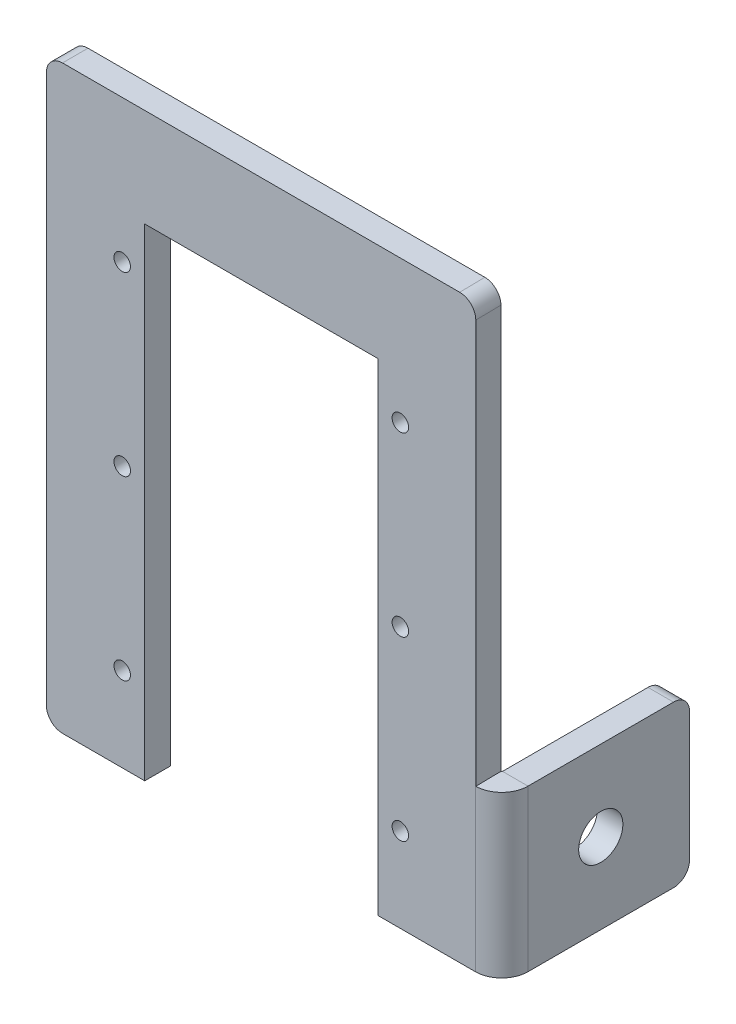
ISO-10303-21;
HEADER;
FILE_DESCRIPTION(('STEP AP214'),'2;1');
FILE_NAME('part.step','',(''),(''),'','','');
FILE_SCHEMA(('AUTOMOTIVE_DESIGN { 1 0 10303 214 1 1 1 1 }'));
ENDSEC;
DATA;
#1=APPLICATION_CONTEXT('core data for automotive mechanical design processes');
#2=APPLICATION_PROTOCOL_DEFINITION('international standard','automotive_design',2000,#1);
#3=PRODUCT_CONTEXT('',#1,'mechanical');
#4=PRODUCT('Part','Part','',(#3));
#5=PRODUCT_RELATED_PRODUCT_CATEGORY('part','',(#4));
#6=PRODUCT_DEFINITION_FORMATION('','',#4);
#7=PRODUCT_DEFINITION_CONTEXT('part definition',#1,'design');
#8=PRODUCT_DEFINITION('design','',#6,#7);
#9=PRODUCT_DEFINITION_SHAPE('','',#8);
#10=(LENGTH_UNIT() NAMED_UNIT(*) SI_UNIT(.MILLI.,.METRE.));
#11=(NAMED_UNIT(*) PLANE_ANGLE_UNIT() SI_UNIT($,.RADIAN.));
#12=(NAMED_UNIT(*) SI_UNIT($,.STERADIAN.) SOLID_ANGLE_UNIT());
#13=UNCERTAINTY_MEASURE_WITH_UNIT(LENGTH_MEASURE(1.E-05),#10,'distance_accuracy_value','');
#14=(GEOMETRIC_REPRESENTATION_CONTEXT(3) GLOBAL_UNCERTAINTY_ASSIGNED_CONTEXT((#13)) GLOBAL_UNIT_ASSIGNED_CONTEXT((#10,
#11,#12)) REPRESENTATION_CONTEXT('',''));
#15=CARTESIAN_POINT('',(0.,0.,0.));
#16=DIRECTION('',(0.,0.,1.));
#17=DIRECTION('',(1.,0.,0.));
#18=AXIS2_PLACEMENT_3D('',#15,#16,#17);
#19=CARTESIAN_POINT('',(26.7316212801133,-30.,6.625));
#20=DIRECTION('',(0.,1.,0.));
#21=DIRECTION('',(1.,0.,0.));
#22=AXIS2_PLACEMENT_3D('',#19,#20,#21);
#23=PLANE('',#22);
#24=DIRECTION('',(0.,0.,1.));
#25=VECTOR('',#24,1.);
#26=CARTESIAN_POINT('',(29.9066212801133,-30.,6.62499999999999));
#27=LINE('',#26,#25);
#28=CARTESIAN_POINT('',(29.9066212801132,-30.,-21.375));
#29=VERTEX_POINT('',#28);
#30=CARTESIAN_POINT('',(29.9066212801132,-30.,-3.27500000000002));
#31=VERTEX_POINT('',#30);
#32=EDGE_CURVE('E211',#29,#31,#27,.T.);
#33=ORIENTED_EDGE('',*,*,#32,.F.);
#34=DIRECTION('',(1.,0.,0.));
#35=VECTOR('',#34,1.);
#36=CARTESIAN_POINT('',(26.7316212801132,-30.,-21.375));
#37=LINE('',#36,#35);
#38=CARTESIAN_POINT('',(26.7316212801132,-30.,-21.375));
#39=VERTEX_POINT('',#38);
#40=EDGE_CURVE('E265',#29,#39,#37,.F.);
#41=ORIENTED_EDGE('',*,*,#40,.T.);
#42=DIRECTION('',(0.,0.,1.));
#43=VECTOR('',#42,1.);
#44=CARTESIAN_POINT('',(26.7316212801133,-30.,6.625));
#45=LINE('',#44,#43);
#46=CARTESIAN_POINT('',(26.7316212801132,-30.,-3.27499999999999));
#47=VERTEX_POINT('',#46);
#48=EDGE_CURVE('E188',#39,#47,#45,.T.);
#49=ORIENTED_EDGE('',*,*,#48,.T.);
#50=DIRECTION('',(1.,0.,0.));
#51=VECTOR('',#50,1.);
#52=CARTESIAN_POINT('',(26.7316212801132,-30.,-3.27499999999999));
#53=LINE('',#52,#51);
#54=EDGE_CURVE('E221',#47,#31,#53,.T.);
#55=ORIENTED_EDGE('',*,*,#54,.T.);
#56=EDGE_LOOP('',(#33,#41,#49,#55));
#57=FACE_BOUND('',#56,.T.);
#58=ADVANCED_FACE('F42',(#57),#23,.T.);
#59=CARTESIAN_POINT('',(26.7316212801132,-50.,-23.375));
#60=DIRECTION('',(0.,-1.,0.));
#61=DIRECTION('',(0.,0.,-1.));
#62=AXIS2_PLACEMENT_3D('',#59,#60,#61);
#63=PLANE('',#62);
#64=DIRECTION('',(0.,0.,-1.));
#65=VECTOR('',#64,1.);
#66=CARTESIAN_POINT('',(26.7316212801132,-50.,-23.375));
#67=LINE('',#66,#65);
#68=CARTESIAN_POINT('',(26.7316212801132,-50.,-3.275));
#69=VERTEX_POINT('',#68);
#70=CARTESIAN_POINT('',(26.7316212801132,-50.,-21.375));
#71=VERTEX_POINT('',#70);
#72=EDGE_CURVE('E202',#69,#71,#67,.T.);
#73=ORIENTED_EDGE('',*,*,#72,.T.);
#74=DIRECTION('',(1.,0.,0.));
#75=VECTOR('',#74,1.);
#76=CARTESIAN_POINT('',(26.7316212801132,-50.,-21.375));
#77=LINE('',#76,#75);
#78=CARTESIAN_POINT('',(29.9066212801132,-50.,-21.375));
#79=VERTEX_POINT('',#78);
#80=EDGE_CURVE('E251',#71,#79,#77,.T.);
#81=ORIENTED_EDGE('',*,*,#80,.T.);
#82=DIRECTION('',(0.,0.,-1.));
#83=VECTOR('',#82,1.);
#84=CARTESIAN_POINT('',(29.9066212801132,-50.,-23.375));
#85=LINE('',#84,#83);
#86=CARTESIAN_POINT('',(29.9066212801132,-50.,-3.27500000000003));
#87=VERTEX_POINT('',#86);
#88=EDGE_CURVE('E216',#87,#79,#85,.T.);
#89=ORIENTED_EDGE('',*,*,#88,.F.);
#90=DIRECTION('',(-1.,0.,0.));
#91=VECTOR('',#90,1.);
#92=CARTESIAN_POINT('',(26.7316212801132,-50.,-3.275));
#93=LINE('',#92,#91);
#94=EDGE_CURVE('E187',#87,#69,#93,.T.);
#95=ORIENTED_EDGE('',*,*,#94,.T.);
#96=EDGE_LOOP('',(#73,#81,#89,#95));
#97=FACE_BOUND('',#96,.T.);
#98=ADVANCED_FACE('F214',(#97),#63,.T.);
#99=CARTESIAN_POINT('',(26.7316212801134,0.,33.3566212801132));
#100=DIRECTION('',(-1.,0.,0.));
#101=DIRECTION('',(0.,0.,1.));
#102=AXIS2_PLACEMENT_3D('',#99,#100,#101);
#103=PLANE('',#102);
#104=CARTESIAN_POINT('',(26.7316212801132,-40.,-12.325));
#105=DIRECTION('',(-1.,0.,0.));
#106=DIRECTION('',(0.,0.,1.));
#107=AXIS2_PLACEMENT_3D('',#104,#105,#106);
#108=CIRCLE('',#107,2.75);
#109=CARTESIAN_POINT('',(26.7316212801132,-40.,-9.57499999999999));
#110=VERTEX_POINT('',#109);
#111=EDGE_CURVE('E512',#110,#110,#108,.T.);
#112=ORIENTED_EDGE('',*,*,#111,.F.);
#113=EDGE_LOOP('',(#112));
#114=FACE_BOUND('',#113,.T.);
#115=DIRECTION('',(0.,1.,0.));
#116=VECTOR('',#115,1.);
#117=CARTESIAN_POINT('',(26.7316212801132,-30.,-23.375));
#118=LINE('',#117,#116);
#119=CARTESIAN_POINT('',(26.7316212801132,-48.,-23.375));
#120=VERTEX_POINT('',#119);
#121=CARTESIAN_POINT('',(26.7316212801132,-32.,-23.375));
#122=VERTEX_POINT('',#121);
#123=EDGE_CURVE('E210',#120,#122,#118,.T.);
#124=ORIENTED_EDGE('',*,*,#123,.F.);
#125=CARTESIAN_POINT('',(26.7316212801132,-48.,-21.375));
#126=DIRECTION('',(-1.,0.,0.));
#127=DIRECTION('',(0.,0.,1.));
#128=AXIS2_PLACEMENT_3D('',#125,#126,#127);
#129=CIRCLE('',#128,2.);
#130=EDGE_CURVE('E206',#120,#71,#129,.T.);
#131=ORIENTED_EDGE('',*,*,#130,.T.);
#132=ORIENTED_EDGE('',*,*,#72,.F.);
#133=DIRECTION('',(0.,1.,0.));
#134=VECTOR('',#133,1.);
#135=CARTESIAN_POINT('',(26.7316212801132,0.,-3.27499999999999));
#136=LINE('',#135,#134);
#137=EDGE_CURVE('E177',#69,#47,#136,.T.);
#138=ORIENTED_EDGE('',*,*,#137,.T.);
#139=ORIENTED_EDGE('',*,*,#48,.F.);
#140=CARTESIAN_POINT('',(26.7316212801132,-32.,-21.375));
#141=DIRECTION('',(-1.,0.,0.));
#142=DIRECTION('',(0.,0.,1.));
#143=AXIS2_PLACEMENT_3D('',#140,#141,#142);
#144=CIRCLE('',#143,2.);
#145=EDGE_CURVE('E262',#39,#122,#144,.T.);
#146=ORIENTED_EDGE('',*,*,#145,.T.);
#147=EDGE_LOOP('',(#124,#131,#132,#138,#139,#146));
#148=FACE_BOUND('',#147,.T.);
#149=ADVANCED_FACE('F204',(#114,#148),#103,.T.);
#150=CARTESIAN_POINT('',(26.7316212801132,-30.,-23.375));
#151=DIRECTION('',(0.,0.,-1.));
#152=DIRECTION('',(-1.,0.,0.));
#153=AXIS2_PLACEMENT_3D('',#150,#151,#152);
#154=PLANE('',#153);
#155=DIRECTION('',(0.,1.,0.));
#156=VECTOR('',#155,1.);
#157=CARTESIAN_POINT('',(29.9066212801132,-30.,-23.375));
#158=LINE('',#157,#156);
#159=CARTESIAN_POINT('',(29.9066212801132,-48.,-23.375));
#160=VERTEX_POINT('',#159);
#161=CARTESIAN_POINT('',(29.9066212801132,-32.,-23.375));
#162=VERTEX_POINT('',#161);
#163=EDGE_CURVE('E230',#160,#162,#158,.T.);
#164=ORIENTED_EDGE('',*,*,#163,.F.);
#165=DIRECTION('',(1.,0.,0.));
#166=VECTOR('',#165,1.);
#167=CARTESIAN_POINT('',(26.7316212801132,-48.,-23.375));
#168=LINE('',#167,#166);
#169=EDGE_CURVE('E260',#160,#120,#168,.F.);
#170=ORIENTED_EDGE('',*,*,#169,.T.);
#171=ORIENTED_EDGE('',*,*,#123,.T.);
#172=DIRECTION('',(1.,0.,0.));
#173=VECTOR('',#172,1.);
#174=CARTESIAN_POINT('',(26.7316212801132,-32.,-23.375));
#175=LINE('',#174,#173);
#176=EDGE_CURVE('E257',#122,#162,#175,.T.);
#177=ORIENTED_EDGE('',*,*,#176,.T.);
#178=EDGE_LOOP('',(#164,#170,#171,#177));
#179=FACE_BOUND('',#178,.T.);
#180=ADVANCED_FACE('F357',(#179),#154,.T.);
#181=CARTESIAN_POINT('',(29.9066212801134,0.,33.3566212801132));
#182=DIRECTION('',(-1.,0.,0.));
#183=DIRECTION('',(0.,0.,1.));
#184=AXIS2_PLACEMENT_3D('',#181,#182,#183);
#185=PLANE('',#184);
#186=CARTESIAN_POINT('',(29.9066212801133,-40.,-12.325));
#187=DIRECTION('',(-1.,0.,0.));
#188=DIRECTION('',(0.,0.,1.));
#189=AXIS2_PLACEMENT_3D('',#186,#187,#188);
#190=CIRCLE('',#189,2.75);
#191=CARTESIAN_POINT('',(29.9066212801133,-40.,-9.575));
#192=VERTEX_POINT('',#191);
#193=EDGE_CURVE('E508',#192,#192,#190,.T.);
#194=ORIENTED_EDGE('',*,*,#193,.T.);
#195=EDGE_LOOP('',(#194));
#196=FACE_BOUND('',#195,.T.);
#197=ORIENTED_EDGE('',*,*,#88,.T.);
#198=CARTESIAN_POINT('',(29.9066212801132,-48.,-21.375));
#199=DIRECTION('',(-1.,0.,0.));
#200=DIRECTION('',(0.,0.,1.));
#201=AXIS2_PLACEMENT_3D('',#198,#199,#200);
#202=CIRCLE('',#201,2.);
#203=EDGE_CURVE('E255',#79,#160,#202,.F.);
#204=ORIENTED_EDGE('',*,*,#203,.T.);
#205=ORIENTED_EDGE('',*,*,#163,.T.);
#206=CARTESIAN_POINT('',(29.9066212801132,-32.,-21.375));
#207=DIRECTION('',(-1.,0.,0.));
#208=DIRECTION('',(0.,0.,1.));
#209=AXIS2_PLACEMENT_3D('',#206,#207,#208);
#210=CIRCLE('',#209,2.);
#211=EDGE_CURVE('E253',#162,#29,#210,.F.);
#212=ORIENTED_EDGE('',*,*,#211,.T.);
#213=ORIENTED_EDGE('',*,*,#32,.T.);
#214=DIRECTION('',(0.,1.,0.));
#215=VECTOR('',#214,1.);
#216=CARTESIAN_POINT('',(29.9066212801132,0.,-3.275));
#217=LINE('',#216,#215);
#218=EDGE_CURVE('E218',#87,#31,#217,.T.);
#219=ORIENTED_EDGE('',*,*,#218,.F.);
#220=EDGE_LOOP('',(#197,#204,#205,#212,#213,#219));
#221=FACE_BOUND('',#220,.T.);
#222=ADVANCED_FACE('F301',(#196,#221),#185,.F.);
#223=CARTESIAN_POINT('',(17.3,-39.5,-3.175));
#224=DIRECTION('',(0.,0.,1.));
#225=DIRECTION('',(1.,0.,0.));
#226=AXIS2_PLACEMENT_3D('',#223,#224,#225);
#227=CYLINDRICAL_SURFACE('',#226,1.02499999999995);
#228=CARTESIAN_POINT('',(17.3,-39.5,-3.175));
#229=DIRECTION('',(0.,0.,1.));
#230=DIRECTION('',(1.,0.,0.));
#231=AXIS2_PLACEMENT_3D('',#228,#229,#230);
#232=CIRCLE('',#231,1.02499999999995);
#233=CARTESIAN_POINT('',(18.325,-39.5,-3.175));
#234=VERTEX_POINT('',#233);
#235=EDGE_CURVE('E430',#234,#234,#232,.T.);
#236=ORIENTED_EDGE('',*,*,#235,.F.);
#237=EDGE_LOOP('',(#236));
#238=FACE_BOUND('',#237,.T.);
#239=CARTESIAN_POINT('',(17.3,-39.5,0.));
#240=DIRECTION('',(0.,0.,1.));
#241=DIRECTION('',(1.,0.,0.));
#242=AXIS2_PLACEMENT_3D('',#239,#240,#241);
#243=CIRCLE('',#242,1.02499999999995);
#244=CARTESIAN_POINT('',(18.325,-39.5,0.));
#245=VERTEX_POINT('',#244);
#246=EDGE_CURVE('E484',#245,#245,#243,.T.);
#247=ORIENTED_EDGE('',*,*,#246,.T.);
#248=EDGE_LOOP('',(#247));
#249=FACE_BOUND('',#248,.T.);
#250=ADVANCED_FACE('F297',(#238,#249),#227,.F.);
#251=CARTESIAN_POINT('',(-17.3,-39.5,-3.175));
#252=DIRECTION('',(0.,0.,1.));
#253=DIRECTION('',(1.,0.,0.));
#254=AXIS2_PLACEMENT_3D('',#251,#252,#253);
#255=CYLINDRICAL_SURFACE('',#254,1.02499999999994);
#256=CARTESIAN_POINT('',(-17.3,-39.5,-3.175));
#257=DIRECTION('',(0.,0.,1.));
#258=DIRECTION('',(-1.,0.,0.));
#259=AXIS2_PLACEMENT_3D('',#256,#257,#258);
#260=CIRCLE('',#259,1.02499999999994);
#261=CARTESIAN_POINT('',(-18.3249999999999,-39.5,-3.175));
#262=VERTEX_POINT('',#261);
#263=EDGE_CURVE('E433',#262,#262,#260,.T.);
#264=ORIENTED_EDGE('',*,*,#263,.F.);
#265=EDGE_LOOP('',(#264));
#266=FACE_BOUND('',#265,.T.);
#267=CARTESIAN_POINT('',(-17.3,-39.5,0.));
#268=DIRECTION('',(0.,0.,1.));
#269=DIRECTION('',(-1.,0.,0.));
#270=AXIS2_PLACEMENT_3D('',#267,#268,#269);
#271=CIRCLE('',#270,1.02499999999994);
#272=CARTESIAN_POINT('',(-18.3249999999999,-39.5,0.));
#273=VERTEX_POINT('',#272);
#274=EDGE_CURVE('E481',#273,#273,#271,.T.);
#275=ORIENTED_EDGE('',*,*,#274,.T.);
#276=EDGE_LOOP('',(#275));
#277=FACE_BOUND('',#276,.T.);
#278=ADVANCED_FACE('F300',(#266,#277),#255,.F.);
#279=CARTESIAN_POINT('',(17.3,-17.5,-3.175));
#280=DIRECTION('',(0.,0.,1.));
#281=DIRECTION('',(1.,0.,0.));
#282=AXIS2_PLACEMENT_3D('',#279,#280,#281);
#283=CYLINDRICAL_SURFACE('',#282,1.02499999999995);
#284=CARTESIAN_POINT('',(17.3,-17.5,-3.175));
#285=DIRECTION('',(0.,0.,1.));
#286=DIRECTION('',(1.,0.,0.));
#287=AXIS2_PLACEMENT_3D('',#284,#285,#286);
#288=CIRCLE('',#287,1.02499999999995);
#289=CARTESIAN_POINT('',(18.325,-17.5,-3.175));
#290=VERTEX_POINT('',#289);
#291=EDGE_CURVE('E436',#290,#290,#288,.T.);
#292=ORIENTED_EDGE('',*,*,#291,.F.);
#293=EDGE_LOOP('',(#292));
#294=FACE_BOUND('',#293,.T.);
#295=CARTESIAN_POINT('',(17.3,-17.5,0.));
#296=DIRECTION('',(0.,0.,1.));
#297=DIRECTION('',(1.,0.,0.));
#298=AXIS2_PLACEMENT_3D('',#295,#296,#297);
#299=CIRCLE('',#298,1.02499999999995);
#300=CARTESIAN_POINT('',(18.325,-17.5,0.));
#301=VERTEX_POINT('',#300);
#302=EDGE_CURVE('E478',#301,#301,#299,.T.);
#303=ORIENTED_EDGE('',*,*,#302,.T.);
#304=EDGE_LOOP('',(#303));
#305=FACE_BOUND('',#304,.T.);
#306=ADVANCED_FACE('F305',(#294,#305),#283,.F.);
#307=CARTESIAN_POINT('',(-17.3,-17.5,-3.175));
#308=DIRECTION('',(0.,0.,1.));
#309=DIRECTION('',(1.,0.,0.));
#310=AXIS2_PLACEMENT_3D('',#307,#308,#309);
#311=CYLINDRICAL_SURFACE('',#310,1.02499999999994);
#312=CARTESIAN_POINT('',(-17.3,-17.5,-3.175));
#313=DIRECTION('',(0.,0.,1.));
#314=DIRECTION('',(-1.,0.,0.));
#315=AXIS2_PLACEMENT_3D('',#312,#313,#314);
#316=CIRCLE('',#315,1.02499999999994);
#317=CARTESIAN_POINT('',(-18.3249999999999,-17.5,-3.175));
#318=VERTEX_POINT('',#317);
#319=EDGE_CURVE('E439',#318,#318,#316,.T.);
#320=ORIENTED_EDGE('',*,*,#319,.F.);
#321=EDGE_LOOP('',(#320));
#322=FACE_BOUND('',#321,.T.);
#323=CARTESIAN_POINT('',(-17.3,-17.5,0.));
#324=DIRECTION('',(0.,0.,1.));
#325=DIRECTION('',(-1.,0.,0.));
#326=AXIS2_PLACEMENT_3D('',#323,#324,#325);
#327=CIRCLE('',#326,1.02499999999994);
#328=CARTESIAN_POINT('',(-18.3249999999999,-17.5,0.));
#329=VERTEX_POINT('',#328);
#330=EDGE_CURVE('E475',#329,#329,#327,.T.);
#331=ORIENTED_EDGE('',*,*,#330,.T.);
#332=EDGE_LOOP('',(#331));
#333=FACE_BOUND('',#332,.T.);
#334=ADVANCED_FACE('F309',(#322,#333),#311,.F.);
#335=CARTESIAN_POINT('',(-17.3,4.49999999999998,-3.175));
#336=DIRECTION('',(0.,0.,1.));
#337=DIRECTION('',(1.,0.,0.));
#338=AXIS2_PLACEMENT_3D('',#335,#336,#337);
#339=CYLINDRICAL_SURFACE('',#338,1.02499999999994);
#340=CARTESIAN_POINT('',(-17.3,4.49999999999998,-3.175));
#341=DIRECTION('',(0.,0.,1.));
#342=DIRECTION('',(-1.,0.,0.));
#343=AXIS2_PLACEMENT_3D('',#340,#341,#342);
#344=CIRCLE('',#343,1.02499999999994);
#345=CARTESIAN_POINT('',(-18.3249999999999,4.49999999999998,-3.175));
#346=VERTEX_POINT('',#345);
#347=EDGE_CURVE('E442',#346,#346,#344,.T.);
#348=ORIENTED_EDGE('',*,*,#347,.F.);
#349=EDGE_LOOP('',(#348));
#350=FACE_BOUND('',#349,.T.);
#351=CARTESIAN_POINT('',(-17.3,4.49999999999998,0.));
#352=DIRECTION('',(0.,0.,1.));
#353=DIRECTION('',(-1.,0.,0.));
#354=AXIS2_PLACEMENT_3D('',#351,#352,#353);
#355=CIRCLE('',#354,1.02499999999994);
#356=CARTESIAN_POINT('',(-18.3249999999999,4.49999999999998,0.));
#357=VERTEX_POINT('',#356);
#358=EDGE_CURVE('E472',#357,#357,#355,.T.);
#359=ORIENTED_EDGE('',*,*,#358,.T.);
#360=EDGE_LOOP('',(#359));
#361=FACE_BOUND('',#360,.T.);
#362=ADVANCED_FACE('F313',(#350,#361),#339,.F.);
#363=CARTESIAN_POINT('',(17.3,4.49999999999998,-3.175));
#364=DIRECTION('',(0.,0.,1.));
#365=DIRECTION('',(1.,0.,0.));
#366=AXIS2_PLACEMENT_3D('',#363,#364,#365);
#367=CYLINDRICAL_SURFACE('',#366,1.02499999999995);
#368=CARTESIAN_POINT('',(17.3,4.49999999999998,-3.175));
#369=DIRECTION('',(0.,0.,1.));
#370=DIRECTION('',(1.,0.,0.));
#371=AXIS2_PLACEMENT_3D('',#368,#369,#370);
#372=CIRCLE('',#371,1.02499999999995);
#373=CARTESIAN_POINT('',(18.325,4.49999999999998,-3.175));
#374=VERTEX_POINT('',#373);
#375=EDGE_CURVE('E445',#374,#374,#372,.T.);
#376=ORIENTED_EDGE('',*,*,#375,.F.);
#377=EDGE_LOOP('',(#376));
#378=FACE_BOUND('',#377,.T.);
#379=CARTESIAN_POINT('',(17.3,4.49999999999998,0.));
#380=DIRECTION('',(0.,0.,1.));
#381=DIRECTION('',(1.,0.,0.));
#382=AXIS2_PLACEMENT_3D('',#379,#380,#381);
#383=CIRCLE('',#382,1.02499999999995);
#384=CARTESIAN_POINT('',(18.325,4.49999999999998,0.));
#385=VERTEX_POINT('',#384);
#386=EDGE_CURVE('E469',#385,#385,#383,.T.);
#387=ORIENTED_EDGE('',*,*,#386,.T.);
#388=EDGE_LOOP('',(#387));
#389=FACE_BOUND('',#388,.T.);
#390=ADVANCED_FACE('F317',(#378,#389),#367,.F.);
#391=CARTESIAN_POINT('',(-26.7316212801132,22.2316212801132,-3.175));
#392=DIRECTION('',(-1.,0.,0.));
#393=DIRECTION('',(0.,-1.,0.));
#394=AXIS2_PLACEMENT_3D('',#391,#392,#393);
#395=PLANE('',#394);
#396=DIRECTION('',(0.,-1.,0.));
#397=VECTOR('',#396,1.);
#398=CARTESIAN_POINT('',(-26.7316212801132,22.2316212801132,-3.175));
#399=LINE('',#398,#397);
#400=CARTESIAN_POINT('',(-26.7316212801132,20.2316212801132,-3.175));
#401=VERTEX_POINT('',#400);
#402=CARTESIAN_POINT('',(-26.7316212801132,-48.,-3.175));
#403=VERTEX_POINT('',#402);
#404=EDGE_CURVE('E398',#401,#403,#399,.T.);
#405=ORIENTED_EDGE('',*,*,#404,.T.);
#406=DIRECTION('',(0.,0.,1.));
#407=VECTOR('',#406,1.);
#408=CARTESIAN_POINT('',(-26.7316212801132,-48.,-3.175));
#409=LINE('',#408,#407);
#410=CARTESIAN_POINT('',(-26.7316212801132,-48.,0.));
#411=VERTEX_POINT('',#410);
#412=EDGE_CURVE('E234',#403,#411,#409,.T.);
#413=ORIENTED_EDGE('',*,*,#412,.T.);
#414=DIRECTION('',(0.,-1.,0.));
#415=VECTOR('',#414,1.);
#416=CARTESIAN_POINT('',(-26.7316212801132,22.2316212801132,0.));
#417=LINE('',#416,#415);
#418=CARTESIAN_POINT('',(-26.7316212801132,20.2316212801132,0.));
#419=VERTEX_POINT('',#418);
#420=EDGE_CURVE('E418',#419,#411,#417,.T.);
#421=ORIENTED_EDGE('',*,*,#420,.F.);
#422=DIRECTION('',(0.,0.,1.));
#423=VECTOR('',#422,1.);
#424=CARTESIAN_POINT('',(-26.7316212801132,20.2316212801132,-3.175));
#425=LINE('',#424,#423);
#426=EDGE_CURVE('E227',#419,#401,#425,.F.);
#427=ORIENTED_EDGE('',*,*,#426,.T.);
#428=EDGE_LOOP('',(#405,#413,#421,#427));
#429=FACE_BOUND('',#428,.T.);
#430=ADVANCED_FACE('F321',(#429),#395,.T.);
#431=CARTESIAN_POINT('',(-26.7316212801132,-50.,-3.175));
#432=DIRECTION('',(0.,-1.,0.));
#433=DIRECTION('',(1.,0.,0.));
#434=AXIS2_PLACEMENT_3D('',#431,#432,#433);
#435=PLANE('',#434);
#436=DIRECTION('',(1.,0.,0.));
#437=VECTOR('',#436,1.);
#438=CARTESIAN_POINT('',(-26.7316212801132,-50.,0.));
#439=LINE('',#438,#437);
#440=CARTESIAN_POINT('',(-24.7316212801132,-50.,0.));
#441=VERTEX_POINT('',#440);
#442=CARTESIAN_POINT('',(-14.5,-50.,0.));
#443=VERTEX_POINT('',#442);
#444=EDGE_CURVE('E416',#441,#443,#439,.T.);
#445=ORIENTED_EDGE('',*,*,#444,.F.);
#446=DIRECTION('',(0.,0.,1.));
#447=VECTOR('',#446,1.);
#448=CARTESIAN_POINT('',(-24.7316212801132,-50.,-3.175));
#449=LINE('',#448,#447);
#450=CARTESIAN_POINT('',(-24.7316212801132,-50.,-3.175));
#451=VERTEX_POINT('',#450);
#452=EDGE_CURVE('E243',#441,#451,#449,.F.);
#453=ORIENTED_EDGE('',*,*,#452,.T.);
#454=DIRECTION('',(1.,0.,0.));
#455=VECTOR('',#454,1.);
#456=CARTESIAN_POINT('',(-26.7316212801132,-50.,-3.175));
#457=LINE('',#456,#455);
#458=CARTESIAN_POINT('',(-14.5,-50.,-3.175));
#459=VERTEX_POINT('',#458);
#460=EDGE_CURVE('E466',#451,#459,#457,.T.);
#461=ORIENTED_EDGE('',*,*,#460,.T.);
#462=DIRECTION('',(0.,0.,1.));
#463=VECTOR('',#462,1.);
#464=CARTESIAN_POINT('',(-14.5,-50.,-3.175));
#465=LINE('',#464,#463);
#466=EDGE_CURVE('E463',#459,#443,#465,.T.);
#467=ORIENTED_EDGE('',*,*,#466,.T.);
#468=EDGE_LOOP('',(#445,#453,#461,#467));
#469=FACE_BOUND('',#468,.T.);
#470=ADVANCED_FACE('F325',(#469),#435,.T.);
#471=CARTESIAN_POINT('',(-14.5,-50.,-3.175));
#472=DIRECTION('',(1.,0.,0.));
#473=DIRECTION('',(0.,0.,-1.));
#474=AXIS2_PLACEMENT_3D('',#471,#472,#473);
#475=PLANE('',#474);
#476=DIRECTION('',(0.,1.,0.));
#477=VECTOR('',#476,1.);
#478=CARTESIAN_POINT('',(-14.5,-50.,0.));
#479=LINE('',#478,#477);
#480=CARTESIAN_POINT('',(-14.5,10.,0.));
#481=VERTEX_POINT('',#480);
#482=EDGE_CURVE('E413',#443,#481,#479,.T.);
#483=ORIENTED_EDGE('',*,*,#482,.F.);
#484=ORIENTED_EDGE('',*,*,#466,.F.);
#485=DIRECTION('',(0.,1.,0.));
#486=VECTOR('',#485,1.);
#487=CARTESIAN_POINT('',(-14.5,-50.,-3.175));
#488=LINE('',#487,#486);
#489=CARTESIAN_POINT('',(-14.5,10.,-3.175));
#490=VERTEX_POINT('',#489);
#491=EDGE_CURVE('E460',#459,#490,#488,.T.);
#492=ORIENTED_EDGE('',*,*,#491,.T.);
#493=DIRECTION('',(0.,0.,1.));
#494=VECTOR('',#493,1.);
#495=CARTESIAN_POINT('',(-14.5,10.,-3.175));
#496=LINE('',#495,#494);
#497=EDGE_CURVE('E458',#490,#481,#496,.T.);
#498=ORIENTED_EDGE('',*,*,#497,.T.);
#499=EDGE_LOOP('',(#483,#484,#492,#498));
#500=FACE_BOUND('',#499,.T.);
#501=ADVANCED_FACE('F329',(#500),#475,.T.);
#502=CARTESIAN_POINT('',(-14.5,10.,-3.175));
#503=DIRECTION('',(0.,-1.,0.));
#504=DIRECTION('',(0.,0.,-1.));
#505=AXIS2_PLACEMENT_3D('',#502,#503,#504);
#506=PLANE('',#505);
#507=DIRECTION('',(1.,0.,0.));
#508=VECTOR('',#507,1.);
#509=CARTESIAN_POINT('',(-14.5,10.,0.));
#510=LINE('',#509,#508);
#511=CARTESIAN_POINT('',(14.5,10.,0.));
#512=VERTEX_POINT('',#511);
#513=EDGE_CURVE('E405',#481,#512,#510,.T.);
#514=ORIENTED_EDGE('',*,*,#513,.F.);
#515=ORIENTED_EDGE('',*,*,#497,.F.);
#516=DIRECTION('',(1.,0.,0.));
#517=VECTOR('',#516,1.);
#518=CARTESIAN_POINT('',(-14.5,10.,-3.175));
#519=LINE('',#518,#517);
#520=CARTESIAN_POINT('',(14.5,10.,-3.175));
#521=VERTEX_POINT('',#520);
#522=EDGE_CURVE('E455',#490,#521,#519,.T.);
#523=ORIENTED_EDGE('',*,*,#522,.T.);
#524=DIRECTION('',(0.,0.,1.));
#525=VECTOR('',#524,1.);
#526=CARTESIAN_POINT('',(14.5,10.,-3.175));
#527=LINE('',#526,#525);
#528=EDGE_CURVE('E453',#521,#512,#527,.T.);
#529=ORIENTED_EDGE('',*,*,#528,.T.);
#530=EDGE_LOOP('',(#514,#515,#523,#529));
#531=FACE_BOUND('',#530,.T.);
#532=ADVANCED_FACE('F333',(#531),#506,.T.);
#533=CARTESIAN_POINT('',(14.5,10.,-3.175));
#534=DIRECTION('',(-1.,0.,0.));
#535=DIRECTION('',(0.,-1.,0.));
#536=AXIS2_PLACEMENT_3D('',#533,#534,#535);
#537=PLANE('',#536);
#538=DIRECTION('',(0.,-1.,0.));
#539=VECTOR('',#538,1.);
#540=CARTESIAN_POINT('',(14.5,10.,0.));
#541=LINE('',#540,#539);
#542=CARTESIAN_POINT('',(14.5,-50.,0.));
#543=VERTEX_POINT('',#542);
#544=EDGE_CURVE('E402',#512,#543,#541,.T.);
#545=ORIENTED_EDGE('',*,*,#544,.F.);
#546=ORIENTED_EDGE('',*,*,#528,.F.);
#547=DIRECTION('',(0.,-1.,0.));
#548=VECTOR('',#547,1.);
#549=CARTESIAN_POINT('',(14.5,10.,-3.175));
#550=LINE('',#549,#548);
#551=CARTESIAN_POINT('',(14.5,-50.,-3.175));
#552=VERTEX_POINT('',#551);
#553=EDGE_CURVE('E450',#521,#552,#550,.T.);
#554=ORIENTED_EDGE('',*,*,#553,.T.);
#555=DIRECTION('',(0.,0.,1.));
#556=VECTOR('',#555,1.);
#557=CARTESIAN_POINT('',(14.5,-50.,-3.175));
#558=LINE('',#557,#556);
#559=EDGE_CURVE('E448',#552,#543,#558,.T.);
#560=ORIENTED_EDGE('',*,*,#559,.T.);
#561=EDGE_LOOP('',(#545,#546,#554,#560));
#562=FACE_BOUND('',#561,.T.);
#563=ADVANCED_FACE('F337',(#562),#537,.T.);
#564=CARTESIAN_POINT('',(0.,0.,-3.175));
#565=DIRECTION('',(0.,0.,-1.));
#566=DIRECTION('',(-1.,0.,0.));
#567=AXIS2_PLACEMENT_3D('',#564,#565,#566);
#568=PLANE('',#567);
#569=ORIENTED_EDGE('',*,*,#460,.F.);
#570=CARTESIAN_POINT('',(-24.7316212801132,-48.,-3.175));
#571=DIRECTION('',(0.,0.,-1.));
#572=DIRECTION('',(-1.,0.,0.));
#573=AXIS2_PLACEMENT_3D('',#570,#571,#572);
#574=CIRCLE('',#573,2.);
#575=EDGE_CURVE('E249',#451,#403,#574,.T.);
#576=ORIENTED_EDGE('',*,*,#575,.T.);
#577=ORIENTED_EDGE('',*,*,#404,.F.);
#578=CARTESIAN_POINT('',(-24.7316212801133,20.2316212801132,-3.175));
#579=DIRECTION('',(0.,0.,-1.));
#580=DIRECTION('',(-1.,0.,0.));
#581=AXIS2_PLACEMENT_3D('',#578,#579,#580);
#582=CIRCLE('',#581,2.);
#583=CARTESIAN_POINT('',(-24.7316212801133,22.2316212801132,-3.175));
#584=VERTEX_POINT('',#583);
#585=EDGE_CURVE('E247',#401,#584,#582,.T.);
#586=ORIENTED_EDGE('',*,*,#585,.T.);
#587=DIRECTION('',(-1.,0.,0.));
#588=VECTOR('',#587,1.);
#589=CARTESIAN_POINT('',(26.7316212801132,22.2316212801132,-3.175));
#590=LINE('',#589,#588);
#591=CARTESIAN_POINT('',(24.6329454401661,22.2316212801132,-3.175));
#592=VERTEX_POINT('',#591);
#593=EDGE_CURVE('E231',#592,#584,#590,.T.);
#594=ORIENTED_EDGE('',*,*,#593,.F.);
#595=CARTESIAN_POINT('',(24.6329454401661,20.2316212801132,-3.175));
#596=DIRECTION('',(0.,0.,-1.));
#597=DIRECTION('',(1.,0.,0.));
#598=AXIS2_PLACEMENT_3D('',#595,#596,#597);
#599=ELLIPSE('',#598,2.00024676547952,2.);
#600=CARTESIAN_POINT('',(26.6316212801132,20.3108706316975,-3.175));
#601=VERTEX_POINT('',#600);
#602=EDGE_CURVE('E245',#592,#601,#599,.T.);
#603=ORIENTED_EDGE('',*,*,#602,.T.);
#604=DIRECTION('',(0.,1.,0.));
#605=VECTOR('',#604,1.);
#606=CARTESIAN_POINT('',(26.6316212801132,0.,-3.175));
#607=LINE('',#606,#605);
#608=CARTESIAN_POINT('',(26.6316212801132,-50.,-3.175));
#609=VERTEX_POINT('',#608);
#610=EDGE_CURVE('E488',#609,#601,#607,.T.);
#611=ORIENTED_EDGE('',*,*,#610,.F.);
#612=DIRECTION('',(1.,0.,0.));
#613=VECTOR('',#612,1.);
#614=CARTESIAN_POINT('',(56.7316212801132,-50.,-3.175));
#615=LINE('',#614,#613);
#616=EDGE_CURVE('E428',#552,#609,#615,.T.);
#617=ORIENTED_EDGE('',*,*,#616,.F.);
#618=ORIENTED_EDGE('',*,*,#553,.F.);
#619=ORIENTED_EDGE('',*,*,#522,.F.);
#620=ORIENTED_EDGE('',*,*,#491,.F.);
#621=EDGE_LOOP('',(#569,#576,#577,#586,#594,#603,#611,#617,#618,#619,#620));
#622=FACE_BOUND('',#621,.T.);
#623=ORIENTED_EDGE('',*,*,#375,.T.);
#624=EDGE_LOOP('',(#623));
#625=FACE_BOUND('',#624,.T.);
#626=ORIENTED_EDGE('',*,*,#347,.T.);
#627=EDGE_LOOP('',(#626));
#628=FACE_BOUND('',#627,.T.);
#629=ORIENTED_EDGE('',*,*,#319,.T.);
#630=EDGE_LOOP('',(#629));
#631=FACE_BOUND('',#630,.T.);
#632=ORIENTED_EDGE('',*,*,#291,.T.);
#633=EDGE_LOOP('',(#632));
#634=FACE_BOUND('',#633,.T.);
#635=ORIENTED_EDGE('',*,*,#263,.T.);
#636=EDGE_LOOP('',(#635));
#637=FACE_BOUND('',#636,.T.);
#638=ORIENTED_EDGE('',*,*,#235,.T.);
#639=EDGE_LOOP('',(#638));
#640=FACE_BOUND('',#639,.T.);
#641=ADVANCED_FACE('F341',(#622,#625,#628,#631,#634,#637,#640),#568,.T.);
#642=CARTESIAN_POINT('',(56.7316212801132,-50.,-3.175));
#643=DIRECTION('',(0.,-1.,0.));
#644=DIRECTION('',(1.,0.,0.));
#645=AXIS2_PLACEMENT_3D('',#642,#643,#644);
#646=PLANE('',#645);
#647=DIRECTION('',(0.,0.,-1.));
#648=VECTOR('',#647,1.);
#649=CARTESIAN_POINT('',(26.6316212801132,-50.,-3.175));
#650=LINE('',#649,#648);
#651=CARTESIAN_POINT('',(26.6316212801132,-50.,0.));
#652=VERTEX_POINT('',#651);
#653=EDGE_CURVE('E197',#652,#609,#650,.T.);
#654=ORIENTED_EDGE('',*,*,#653,.F.);
#655=DIRECTION('',(1.,0.,0.));
#656=VECTOR('',#655,1.);
#657=CARTESIAN_POINT('',(56.7316212801132,-50.,0.));
#658=LINE('',#657,#656);
#659=EDGE_CURVE('E426',#543,#652,#658,.T.);
#660=ORIENTED_EDGE('',*,*,#659,.F.);
#661=ORIENTED_EDGE('',*,*,#559,.F.);
#662=ORIENTED_EDGE('',*,*,#616,.T.);
#663=EDGE_LOOP('',(#654,#660,#661,#662));
#664=FACE_BOUND('',#663,.T.);
#665=ADVANCED_FACE('F345',(#664),#646,.T.);
#666=CARTESIAN_POINT('',(0.,0.,0.));
#667=DIRECTION('',(0.,0.,-1.));
#668=DIRECTION('',(-1.,0.,0.));
#669=AXIS2_PLACEMENT_3D('',#666,#667,#668);
#670=PLANE('',#669);
#671=ORIENTED_EDGE('',*,*,#386,.F.);
#672=EDGE_LOOP('',(#671));
#673=FACE_BOUND('',#672,.T.);
#674=ORIENTED_EDGE('',*,*,#358,.F.);
#675=EDGE_LOOP('',(#674));
#676=FACE_BOUND('',#675,.T.);
#677=ORIENTED_EDGE('',*,*,#330,.F.);
#678=EDGE_LOOP('',(#677));
#679=FACE_BOUND('',#678,.T.);
#680=ORIENTED_EDGE('',*,*,#302,.F.);
#681=EDGE_LOOP('',(#680));
#682=FACE_BOUND('',#681,.T.);
#683=ORIENTED_EDGE('',*,*,#274,.F.);
#684=EDGE_LOOP('',(#683));
#685=FACE_BOUND('',#684,.T.);
#686=ORIENTED_EDGE('',*,*,#246,.F.);
#687=EDGE_LOOP('',(#686));
#688=FACE_BOUND('',#687,.T.);
#689=ORIENTED_EDGE('',*,*,#420,.T.);
#690=CARTESIAN_POINT('',(-24.7316212801132,-48.,0.));
#691=DIRECTION('',(0.,0.,-1.));
#692=DIRECTION('',(-1.,0.,0.));
#693=AXIS2_PLACEMENT_3D('',#690,#691,#692);
#694=CIRCLE('',#693,2.);
#695=EDGE_CURVE('E241',#411,#441,#694,.F.);
#696=ORIENTED_EDGE('',*,*,#695,.T.);
#697=ORIENTED_EDGE('',*,*,#444,.T.);
#698=ORIENTED_EDGE('',*,*,#482,.T.);
#699=ORIENTED_EDGE('',*,*,#513,.T.);
#700=ORIENTED_EDGE('',*,*,#544,.T.);
#701=ORIENTED_EDGE('',*,*,#659,.T.);
#702=DIRECTION('',(0.,1.,0.));
#703=VECTOR('',#702,1.);
#704=CARTESIAN_POINT('',(26.6316212801132,0.,0.));
#705=LINE('',#704,#703);
#706=CARTESIAN_POINT('',(26.6316212801132,20.682309234851,0.));
#707=VERTEX_POINT('',#706);
#708=EDGE_CURVE('E423',#652,#707,#705,.T.);
#709=ORIENTED_EDGE('',*,*,#708,.T.);
#710=CARTESIAN_POINT('',(24.6828223258186,20.2316212801132,0.));
#711=DIRECTION('',(0.,0.,-1.));
#712=DIRECTION('',(1.,0.,0.));
#713=AXIS2_PLACEMENT_3D('',#710,#711,#712);
#714=ELLIPSE('',#713,2.00024676547952,2.);
#715=CARTESIAN_POINT('',(24.6828223258186,22.2316212801132,0.));
#716=VERTEX_POINT('',#715);
#717=EDGE_CURVE('E237',#707,#716,#714,.F.);
#718=ORIENTED_EDGE('',*,*,#717,.T.);
#719=DIRECTION('',(-1.,0.,0.));
#720=VECTOR('',#719,1.);
#721=CARTESIAN_POINT('',(26.7316212801132,22.2316212801132,0.));
#722=LINE('',#721,#720);
#723=CARTESIAN_POINT('',(-24.7316212801133,22.2316212801132,0.));
#724=VERTEX_POINT('',#723);
#725=EDGE_CURVE('E421',#716,#724,#722,.T.);
#726=ORIENTED_EDGE('',*,*,#725,.T.);
#727=CARTESIAN_POINT('',(-24.7316212801133,20.2316212801132,0.));
#728=DIRECTION('',(0.,0.,-1.));
#729=DIRECTION('',(-1.,0.,0.));
#730=AXIS2_PLACEMENT_3D('',#727,#728,#729);
#731=CIRCLE('',#730,2.);
#732=EDGE_CURVE('E239',#724,#419,#731,.F.);
#733=ORIENTED_EDGE('',*,*,#732,.T.);
#734=EDGE_LOOP('',(#689,#696,#697,#698,#699,#700,#701,#709,#718,#726,#733));
#735=FACE_BOUND('',#734,.T.);
#736=ADVANCED_FACE('F349',(#673,#676,#679,#682,#685,#688,#735),#670,.F.);
#737=CARTESIAN_POINT('',(26.7316212801132,22.2316212801132,-3.175));
#738=DIRECTION('',(0.,1.,0.));
#739=DIRECTION('',(0.,0.,1.));
#740=AXIS2_PLACEMENT_3D('',#737,#738,#739);
#741=PLANE('',#740);
#742=ORIENTED_EDGE('',*,*,#593,.T.);
#743=DIRECTION('',(0.,0.,1.));
#744=VECTOR('',#743,1.);
#745=CARTESIAN_POINT('',(-24.7316212801133,22.2316212801132,-3.175));
#746=LINE('',#745,#744);
#747=EDGE_CURVE('E270',#584,#724,#746,.T.);
#748=ORIENTED_EDGE('',*,*,#747,.T.);
#749=ORIENTED_EDGE('',*,*,#725,.F.);
#750=DIRECTION('',(0.0157073173117847,0.,0.999876632481661));
#751=VECTOR('',#750,1.);
#752=CARTESIAN_POINT('',(24.6334632250855,22.2316212801132,-3.14203949940424));
#753=LINE('',#752,#751);
#754=EDGE_CURVE('E267',#716,#592,#753,.F.);
#755=ORIENTED_EDGE('',*,*,#754,.T.);
#756=EDGE_LOOP('',(#742,#748,#749,#755));
#757=FACE_BOUND('',#756,.T.);
#758=ADVANCED_FACE('F293',(#757),#741,.T.);
#759=CARTESIAN_POINT('',(26.6316212801132,-50.,-3.275));
#760=DIRECTION('',(0.,1.,0.));
#761=DIRECTION('',(0.,0.,1.));
#762=AXIS2_PLACEMENT_3D('',#759,#760,#761);
#763=PLANE('',#762);
#764=ORIENTED_EDGE('',*,*,#94,.F.);
#765=CARTESIAN_POINT('',(26.6316212801132,-50.,-3.275));
#766=DIRECTION('',(0.,-1.,0.));
#767=DIRECTION('',(1.,0.,0.));
#768=AXIS2_PLACEMENT_3D('',#765,#766,#767);
#769=CIRCLE('',#768,3.275);
#770=EDGE_CURVE('E500',#87,#652,#769,.T.);
#771=ORIENTED_EDGE('',*,*,#770,.T.);
#772=ORIENTED_EDGE('',*,*,#653,.T.);
#773=CARTESIAN_POINT('',(26.6316212801132,-50.,-3.275));
#774=DIRECTION('',(0.,-1.,0.));
#775=DIRECTION('',(0.,0.,1.));
#776=AXIS2_PLACEMENT_3D('',#773,#774,#775);
#777=CIRCLE('',#776,0.0999999999999996);
#778=EDGE_CURVE('E180',#69,#609,#777,.T.);
#779=ORIENTED_EDGE('',*,*,#778,.F.);
#780=EDGE_LOOP('',(#764,#771,#772,#779));
#781=FACE_BOUND('',#780,.T.);
#782=ADVANCED_FACE('F192',(#781),#763,.F.);
#783=CARTESIAN_POINT('',(26.6331920118444,-3.88418935994338,-3.17501233675183));
#784=DIRECTION('',(-0.999876632481661,0.,0.0157073173117847));
#785=DIRECTION('',(0.,-1.,0.));
#786=AXIS2_PLACEMENT_3D('',#783,#784,#785);
#787=PLANE('',#786);
#788=DIRECTION('',(0.,-1.,0.));
#789=VECTOR('',#788,1.);
#790=CARTESIAN_POINT('',(26.6331920118444,-30.,-3.17501233675183));
#791=LINE('',#790,#789);
#792=CARTESIAN_POINT('',(26.6331920118444,20.2316212801132,-3.17501233675183));
#793=VERTEX_POINT('',#792);
#794=CARTESIAN_POINT('',(26.6331920118444,-30.,-3.17501233675183));
#795=VERTEX_POINT('',#794);
#796=EDGE_CURVE('E198',#793,#795,#791,.T.);
#797=ORIENTED_EDGE('',*,*,#796,.F.);
#798=DIRECTION('',(-0.0157073173117847,0.,-0.999876632481661));
#799=VECTOR('',#798,1.);
#800=CARTESIAN_POINT('',(26.6331920118444,20.2316212801132,-3.17501233675183));
#801=LINE('',#800,#799);
#802=CARTESIAN_POINT('',(26.6830627443093,20.2316212801132,-0.000404028622558606));
#803=VERTEX_POINT('',#802);
#804=EDGE_CURVE('E55',#793,#803,#801,.F.);
#805=ORIENTED_EDGE('',*,*,#804,.T.);
#806=DIRECTION('',(0.,-1.,0.));
#807=VECTOR('',#806,1.);
#808=CARTESIAN_POINT('',(26.6830627443093,59.1054519445164,-0.000404028622558606));
#809=LINE('',#808,#807);
#810=CARTESIAN_POINT('',(26.6830627443092,-30.,-0.000404028622557739));
#811=VERTEX_POINT('',#810);
#812=EDGE_CURVE('E503',#803,#811,#809,.T.);
#813=ORIENTED_EDGE('',*,*,#812,.T.);
#814=DIRECTION('',(-0.0157073173117523,0.,-0.999876632481662));
#815=VECTOR('',#814,1.);
#816=CARTESIAN_POINT('',(26.6331920118444,-30.,-3.17501233675183));
#817=LINE('',#816,#815);
#818=EDGE_CURVE('E408',#811,#795,#817,.T.);
#819=ORIENTED_EDGE('',*,*,#818,.T.);
#820=EDGE_LOOP('',(#797,#805,#813,#819));
#821=FACE_BOUND('',#820,.T.);
#822=ADVANCED_FACE('F288',(#821),#787,.F.);
#823=CARTESIAN_POINT('',(26.6316212801132,-30.,-3.275));
#824=DIRECTION('',(0.,-1.,0.));
#825=DIRECTION('',(0.,0.,-1.));
#826=AXIS2_PLACEMENT_3D('',#823,#824,#825);
#827=PLANE('',#826);
#828=CARTESIAN_POINT('',(26.6316212801132,-30.,-3.275));
#829=DIRECTION('',(0.,-1.,0.));
#830=DIRECTION('',(1.,0.,0.));
#831=AXIS2_PLACEMENT_3D('',#828,#829,#830);
#832=CIRCLE('',#831,3.275);
#833=EDGE_CURVE('E199',#811,#31,#832,.F.);
#834=ORIENTED_EDGE('',*,*,#833,.T.);
#835=ORIENTED_EDGE('',*,*,#54,.F.);
#836=CARTESIAN_POINT('',(26.6316212801132,-30.,-3.275));
#837=DIRECTION('',(0.,1.,0.));
#838=DIRECTION('',(0.,0.,-1.));
#839=AXIS2_PLACEMENT_3D('',#836,#837,#838);
#840=CIRCLE('',#839,0.0999999999999997);
#841=EDGE_CURVE('E182',#795,#47,#840,.T.);
#842=ORIENTED_EDGE('',*,*,#841,.F.);
#843=ORIENTED_EDGE('',*,*,#818,.F.);
#844=EDGE_LOOP('',(#834,#835,#842,#843));
#845=FACE_BOUND('',#844,.T.);
#846=ADVANCED_FACE('F281',(#845),#827,.F.);
#847=CARTESIAN_POINT('',(26.6316212801132,59.1054519445164,-3.275));
#848=DIRECTION('',(0.,-1.,0.));
#849=DIRECTION('',(1.,0.,0.));
#850=AXIS2_PLACEMENT_3D('',#847,#848,#849);
#851=CYLINDRICAL_SURFACE('',#850,0.1);
#852=ORIENTED_EDGE('',*,*,#610,.T.);
#853=CARTESIAN_POINT('',(26.6316212801132,20.3108706316975,-3.175));
#854=CARTESIAN_POINT('',(26.6321448558643,20.297667595186,-3.17500257001419));
#855=CARTESIAN_POINT('',(26.6325375380507,20.2844619643083,-3.17500488308394));
#856=CARTESIAN_POINT('',(26.6330611152952,20.2580455137802,-3.17500899533455));
#857=CARTESIAN_POINT('',(26.6331920103525,20.2448346941299,-3.17501079451542));
#858=CARTESIAN_POINT('',(26.6331920118444,20.2316212801132,-3.17501233675183));
#859=B_SPLINE_CURVE_WITH_KNOTS('',3,(#853,#854,#855,#856,#857,#858),.UNSPECIFIED.,.F.,.F.,(4,2,
4),(0.,0.0396344045466501,0.0792688092132867),.UNSPECIFIED.);
#860=EDGE_CURVE('E69',#601,#793,#859,.T.);
#861=ORIENTED_EDGE('',*,*,#860,.T.);
#862=ORIENTED_EDGE('',*,*,#796,.T.);
#863=ORIENTED_EDGE('',*,*,#841,.T.);
#864=ORIENTED_EDGE('',*,*,#137,.F.);
#865=ORIENTED_EDGE('',*,*,#778,.T.);
#866=EDGE_LOOP('',(#852,#861,#862,#863,#864,#865));
#867=FACE_BOUND('',#866,.T.);
#868=ADVANCED_FACE('F179',(#867),#851,.F.);
#869=CARTESIAN_POINT('',(26.6316212801132,59.1054519445164,-3.275));
#870=DIRECTION('',(0.,-1.,0.));
#871=DIRECTION('',(1.,0.,0.));
#872=AXIS2_PLACEMENT_3D('',#869,#870,#871);
#873=CYLINDRICAL_SURFACE('',#872,3.275);
#874=ORIENTED_EDGE('',*,*,#812,.F.);
#875=CARTESIAN_POINT('',(26.6830627443093,20.2316212801132,-0.00040402862255947));
#876=CARTESIAN_POINT('',(26.6830638704008,20.269565144943,-0.000406169742828526));
#877=CARTESIAN_POINT('',(26.681983075847,20.3075088756464,-0.000387065374192086));
#878=CARTESIAN_POINT('',(26.6776730689805,20.3831515696086,-0.000322560958849576));
#879=CARTESIAN_POINT('',(26.6744507822214,20.4208509276019,-0.000277245738700674));
#880=CARTESIAN_POINT('',(26.6658730899428,20.4960061883386,-0.00017632177072756));
#881=CARTESIAN_POINT('',(26.6605176841277,20.5334620910481,-0.00012071302147658));
#882=CARTESIAN_POINT('',(26.6476714679349,20.608130463547,-3.350377342011E-05));
#883=CARTESIAN_POINT('',(26.6401738185281,20.6453417568415,-1.98137294540336E-06));
#884=CARTESIAN_POINT('',(26.6316212801132,20.682309234851,0.));
#885=B_SPLINE_CURVE_WITH_KNOTS('',3,(#875,#876,#877,#878,#879,#880,#881,#882,#883,#884),
.UNSPECIFIED.,.F.,.F.,(4,2,2,2,4),(0.,0.113815985516007,0.22726567142883,0.340715373066735,
0.454531384650052),.UNSPECIFIED.);
#886=EDGE_CURVE('E12',#803,#707,#885,.T.);
#887=ORIENTED_EDGE('',*,*,#886,.T.);
#888=ORIENTED_EDGE('',*,*,#708,.F.);
#889=ORIENTED_EDGE('',*,*,#770,.F.);
#890=ORIENTED_EDGE('',*,*,#218,.T.);
#891=ORIENTED_EDGE('',*,*,#833,.F.);
#892=EDGE_LOOP('',(#874,#887,#888,#889,#890,#891));
#893=FACE_BOUND('',#892,.T.);
#894=ADVANCED_FACE('F280',(#893),#873,.T.);
#895=CARTESIAN_POINT('',(-24.7316212801132,-48.,-3.175));
#896=DIRECTION('',(0.,0.,1.));
#897=DIRECTION('',(1.,0.,0.));
#898=AXIS2_PLACEMENT_3D('',#895,#896,#897);
#899=CYLINDRICAL_SURFACE('',#898,2.);
#900=ORIENTED_EDGE('',*,*,#575,.F.);
#901=ORIENTED_EDGE('',*,*,#452,.F.);
#902=ORIENTED_EDGE('',*,*,#695,.F.);
#903=ORIENTED_EDGE('',*,*,#412,.F.);
#904=EDGE_LOOP('',(#900,#901,#902,#903));
#905=FACE_BOUND('',#904,.T.);
#906=ADVANCED_FACE('F286',(#905),#899,.T.);
#907=CARTESIAN_POINT('',(26.7316212801132,-48.,-21.375));
#908=DIRECTION('',(1.,0.,0.));
#909=DIRECTION('',(0.,0.,-1.));
#910=AXIS2_PLACEMENT_3D('',#907,#908,#909);
#911=CYLINDRICAL_SURFACE('',#910,2.);
#912=ORIENTED_EDGE('',*,*,#130,.F.);
#913=ORIENTED_EDGE('',*,*,#169,.F.);
#914=ORIENTED_EDGE('',*,*,#203,.F.);
#915=ORIENTED_EDGE('',*,*,#80,.F.);
#916=EDGE_LOOP('',(#912,#913,#914,#915));
#917=FACE_BOUND('',#916,.T.);
#918=ADVANCED_FACE('F374',(#917),#911,.T.);
#919=CARTESIAN_POINT('',(26.7316212801132,-32.,-21.375));
#920=DIRECTION('',(1.,0.,0.));
#921=DIRECTION('',(0.,0.,-1.));
#922=AXIS2_PLACEMENT_3D('',#919,#920,#921);
#923=CYLINDRICAL_SURFACE('',#922,2.);
#924=ORIENTED_EDGE('',*,*,#145,.F.);
#925=ORIENTED_EDGE('',*,*,#40,.F.);
#926=ORIENTED_EDGE('',*,*,#211,.F.);
#927=ORIENTED_EDGE('',*,*,#176,.F.);
#928=EDGE_LOOP('',(#924,#925,#926,#927));
#929=FACE_BOUND('',#928,.T.);
#930=ADVANCED_FACE('F378',(#929),#923,.T.);
#931=CARTESIAN_POINT('',(-24.7316212801133,20.2316212801132,-3.175));
#932=DIRECTION('',(0.,0.,1.));
#933=DIRECTION('',(1.,0.,0.));
#934=AXIS2_PLACEMENT_3D('',#931,#932,#933);
#935=CYLINDRICAL_SURFACE('',#934,2.);
#936=ORIENTED_EDGE('',*,*,#585,.F.);
#937=ORIENTED_EDGE('',*,*,#426,.F.);
#938=ORIENTED_EDGE('',*,*,#732,.F.);
#939=ORIENTED_EDGE('',*,*,#747,.F.);
#940=EDGE_LOOP('',(#936,#937,#938,#939));
#941=FACE_BOUND('',#940,.T.);
#942=ADVANCED_FACE('F381',(#941),#935,.T.);
#943=CARTESIAN_POINT('',(24.6334632250855,20.2316212801132,-3.14203949940424));
#944=DIRECTION('',(0.0157073173117847,0.,0.999876632481661));
#945=DIRECTION('',(0.999876632481661,0.,-0.0157073173117847));
#946=AXIS2_PLACEMENT_3D('',#943,#944,#945);
#947=CYLINDRICAL_SURFACE('',#946,2.);
#948=ORIENTED_EDGE('',*,*,#886,.F.);
#949=ORIENTED_EDGE('',*,*,#804,.F.);
#950=ORIENTED_EDGE('',*,*,#860,.F.);
#951=ORIENTED_EDGE('',*,*,#602,.F.);
#952=ORIENTED_EDGE('',*,*,#754,.F.);
#953=ORIENTED_EDGE('',*,*,#717,.F.);
#954=EDGE_LOOP('',(#948,#949,#950,#951,#952,#953));
#955=FACE_BOUND('',#954,.T.);
#956=ADVANCED_FACE('F44',(#955),#947,.T.);
#957=CARTESIAN_POINT('',(29.9066212801133,-40.,-12.325));
#958=DIRECTION('',(-1.,0.,0.));
#959=DIRECTION('',(0.,0.,1.));
#960=AXIS2_PLACEMENT_3D('',#957,#958,#959);
#961=CYLINDRICAL_SURFACE('',#960,2.75);
#962=ORIENTED_EDGE('',*,*,#193,.F.);
#963=EDGE_LOOP('',(#962));
#964=FACE_BOUND('',#963,.T.);
#965=ORIENTED_EDGE('',*,*,#111,.T.);
#966=EDGE_LOOP('',(#965));
#967=FACE_BOUND('',#966,.T.);
#968=ADVANCED_FACE('F282',(#964,#967),#961,.F.);
#969=CLOSED_SHELL('',(#58,#98,#149,#180,#222,#250,#278,#306,#334,#362,#390,#430,#470,#501,#532,
#563,#641,#665,#736,#758,#782,#822,#846,#868,#894,#906,#918,#930,#942,#956,#968));
#970=MANIFOLD_SOLID_BREP('B2',#969);
#971=ADVANCED_BREP_SHAPE_REPRESENTATION('',(#18,#970),#14);
#972=SHAPE_DEFINITION_REPRESENTATION(#9,#971);
ENDSEC;
END-ISO-10303-21;
